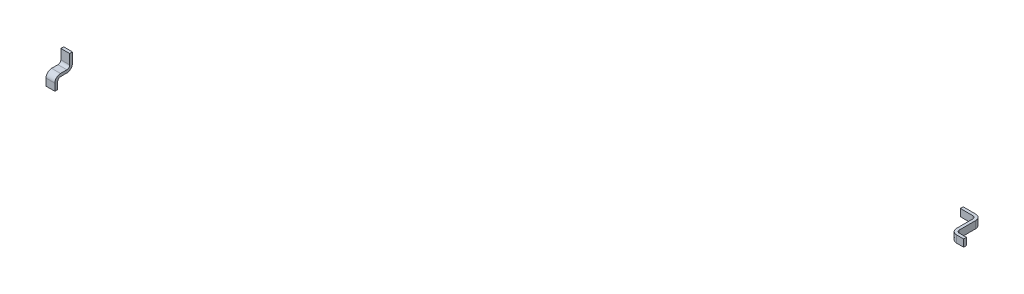
ISO-10303-21;
HEADER;
FILE_DESCRIPTION(('STEP AP214'),'2;1');
FILE_NAME('part.step','',(''),(''),'','','');
FILE_SCHEMA(('AUTOMOTIVE_DESIGN { 1 0 10303 214 1 1 1 1 }'));
ENDSEC;
DATA;
#1=APPLICATION_CONTEXT('core data for automotive mechanical design processes');
#2=APPLICATION_PROTOCOL_DEFINITION('international standard','automotive_design',2000,#1);
#3=PRODUCT_CONTEXT('',#1,'mechanical');
#4=PRODUCT('Part','Part','',(#3));
#5=PRODUCT_RELATED_PRODUCT_CATEGORY('part','',(#4));
#6=PRODUCT_DEFINITION_FORMATION('','',#4);
#7=PRODUCT_DEFINITION_CONTEXT('part definition',#1,'design');
#8=PRODUCT_DEFINITION('design','',#6,#7);
#9=PRODUCT_DEFINITION_SHAPE('','',#8);
#10=(LENGTH_UNIT() NAMED_UNIT(*) SI_UNIT(.MILLI.,.METRE.));
#11=(NAMED_UNIT(*) PLANE_ANGLE_UNIT() SI_UNIT($,.RADIAN.));
#12=(NAMED_UNIT(*) SI_UNIT($,.STERADIAN.) SOLID_ANGLE_UNIT());
#13=UNCERTAINTY_MEASURE_WITH_UNIT(LENGTH_MEASURE(1.E-05),#10,'distance_accuracy_value','');
#14=(GEOMETRIC_REPRESENTATION_CONTEXT(3) GLOBAL_UNCERTAINTY_ASSIGNED_CONTEXT((#13)) GLOBAL_UNIT_ASSIGNED_CONTEXT((#10,
#11,#12)) REPRESENTATION_CONTEXT('',''));
#15=CARTESIAN_POINT('',(0.,0.,0.));
#16=DIRECTION('',(0.,0.,1.));
#17=DIRECTION('',(1.,0.,0.));
#18=AXIS2_PLACEMENT_3D('',#15,#16,#17);
#19=CARTESIAN_POINT('',(-31.0295005463849,-0.229824856254154,2.05031594000001));
#20=DIRECTION('',(4.371138828674E-08,-1.,0.));
#21=DIRECTION('',(0.,0.,-1.));
#22=AXIS2_PLACEMENT_3D('',#19,#20,#21);
#23=PLANE('',#22);
#24=DIRECTION('',(1.,4.371138828674E-08,0.));
#25=VECTOR('',#24,1.);
#26=CARTESIAN_POINT('',(-31.0295005463849,-0.229824856254154,2.05031594000001));
#27=LINE('',#26,#25);
#28=CARTESIAN_POINT('',(-31.3445005463849,-0.229824870023251,2.05031594000001));
#29=VERTEX_POINT('',#28);
#30=CARTESIAN_POINT('',(-31.0295005463849,-0.229824856254154,2.05031594000001));
#31=VERTEX_POINT('',#30);
#32=EDGE_CURVE('P0_E193',#29,#31,#27,.T.);
#33=ORIENTED_EDGE('',*,*,#32,.F.);
#34=DIRECTION('',(0.,0.,-1.));
#35=VECTOR('',#34,1.);
#36=CARTESIAN_POINT('',(-31.3445005463849,-0.229824870023251,2.57531594000001));
#37=LINE('',#36,#35);
#38=CARTESIAN_POINT('',(-31.3445005463849,-0.229824870023251,2.15031594000001));
#39=VERTEX_POINT('',#38);
#40=EDGE_CURVE('P0_E11',#39,#29,#37,.T.);
#41=ORIENTED_EDGE('',*,*,#40,.F.);
#42=DIRECTION('',(-1.,-4.371138828674E-08,0.));
#43=VECTOR('',#42,1.);
#44=CARTESIAN_POINT('',(-31.3445005463849,-0.229824870023251,2.15031594000001));
#45=LINE('',#44,#43);
#46=CARTESIAN_POINT('',(-31.0295005463849,-0.229824856254154,2.15031594000001));
#47=VERTEX_POINT('',#46);
#48=EDGE_CURVE('P0_E122',#47,#39,#45,.T.);
#49=ORIENTED_EDGE('',*,*,#48,.F.);
#50=DIRECTION('',(0.,0.,1.));
#51=VECTOR('',#50,1.);
#52=CARTESIAN_POINT('',(-31.0295005463849,-0.229824856254154,2.67531594000001));
#53=LINE('',#52,#51);
#54=EDGE_CURVE('P0_E124',#31,#47,#53,.T.);
#55=ORIENTED_EDGE('',*,*,#54,.F.);
#56=EDGE_LOOP('',(#33,#41,#49,#55));
#57=FACE_BOUND('',#56,.T.);
#58=ADVANCED_FACE('P0_F17',(#57),#23,.F.);
#59=CARTESIAN_POINT('',(-31.3445005070446,-1.12982487002325,2.57531594000001));
#60=DIRECTION('',(1.,4.371138828674E-08,0.));
#61=DIRECTION('',(0.,0.,-1.));
#62=AXIS2_PLACEMENT_3D('',#59,#60,#61);
#63=PLANE('',#62);
#64=DIRECTION('',(-4.371138828674E-08,1.,0.));
#65=VECTOR('',#64,1.);
#66=CARTESIAN_POINT('',(-31.3445005070446,-1.12982487002325,2.67531594000001));
#67=LINE('',#66,#65);
#68=CARTESIAN_POINT('',(-31.3445005070446,-1.12982487002325,2.67531594000001));
#69=VERTEX_POINT('',#68);
#70=CARTESIAN_POINT('',(-31.3445005179725,-0.879824870023249,2.67531594000001));
#71=VERTEX_POINT('',#70);
#72=EDGE_CURVE('P0_E241',#69,#71,#67,.T.);
#73=ORIENTED_EDGE('',*,*,#72,.T.);
#74=CARTESIAN_POINT('',(-31.3445005179725,-0.879824870023249,2.47531594000001));
#75=DIRECTION('',(-1.,-4.371138828674E-08,0.));
#76=DIRECTION('',(0.,0.,-1.));
#77=AXIS2_PLACEMENT_3D('',#74,#75,#76);
#78=CIRCLE('',#77,0.2);
#79=CARTESIAN_POINT('',(-31.3445005267148,-0.679824870023243,2.47531594000001));
#80=VERTEX_POINT('',#79);
#81=EDGE_CURVE('P0_E174',#71,#80,#78,.T.);
#82=ORIENTED_EDGE('',*,*,#81,.T.);
#83=DIRECTION('',(0.,0.,-1.));
#84=VECTOR('',#83,1.);
#85=CARTESIAN_POINT('',(-31.3445005267148,-0.679824870023243,2.57531594000001));
#86=LINE('',#85,#84);
#87=CARTESIAN_POINT('',(-31.3445005267148,-0.679824870023243,2.25031594000001));
#88=VERTEX_POINT('',#87);
#89=EDGE_CURVE('P0_E169',#80,#88,#86,.T.);
#90=ORIENTED_EDGE('',*,*,#89,.T.);
#91=CARTESIAN_POINT('',(-31.3445005310859,-0.579824870023241,2.25031594000001));
#92=DIRECTION('',(1.,4.371138828674E-08,0.));
#93=DIRECTION('',(0.,0.,-1.));
#94=AXIS2_PLACEMENT_3D('',#91,#92,#93);
#95=CIRCLE('',#94,0.1);
#96=CARTESIAN_POINT('',(-31.3445005310859,-0.579824870023241,2.15031594000001));
#97=VERTEX_POINT('',#96);
#98=EDGE_CURVE('P0_E127',#88,#97,#95,.T.);
#99=ORIENTED_EDGE('',*,*,#98,.T.);
#100=DIRECTION('',(-4.371138828674E-08,1.,0.));
#101=VECTOR('',#100,1.);
#102=CARTESIAN_POINT('',(-31.3445005070446,-1.12982487002325,2.15031594000001));
#103=LINE('',#102,#101);
#104=EDGE_CURVE('P0_E28',#97,#39,#103,.T.);
#105=ORIENTED_EDGE('',*,*,#104,.T.);
#106=ORIENTED_EDGE('',*,*,#40,.T.);
#107=DIRECTION('',(-4.371138828674E-08,1.,0.));
#108=VECTOR('',#107,1.);
#109=CARTESIAN_POINT('',(-31.3445005310859,-0.579824870023241,2.05031594000001));
#110=LINE('',#109,#108);
#111=CARTESIAN_POINT('',(-31.3445005310859,-0.579824870023241,2.05031594000001));
#112=VERTEX_POINT('',#111);
#113=EDGE_CURVE('P0_E149',#112,#29,#110,.T.);
#114=ORIENTED_EDGE('',*,*,#113,.F.);
#115=CARTESIAN_POINT('',(-31.3445005310859,-0.579824870023241,2.25031594000001));
#116=DIRECTION('',(1.,4.371138828674E-08,0.));
#117=DIRECTION('',(0.,0.,-1.));
#118=AXIS2_PLACEMENT_3D('',#115,#116,#117);
#119=CIRCLE('',#118,0.2);
#120=CARTESIAN_POINT('',(-31.3445005223436,-0.779824870023246,2.25031594000001));
#121=VERTEX_POINT('',#120);
#122=EDGE_CURVE('P0_E159',#121,#112,#119,.T.);
#123=ORIENTED_EDGE('',*,*,#122,.F.);
#124=DIRECTION('',(0.,0.,-1.));
#125=VECTOR('',#124,1.);
#126=CARTESIAN_POINT('',(-31.3445005223436,-0.779824870023246,2.47531594000001));
#127=LINE('',#126,#125);
#128=CARTESIAN_POINT('',(-31.3445005223436,-0.779824870023246,2.47531594000001));
#129=VERTEX_POINT('',#128);
#130=EDGE_CURVE('P0_E164',#129,#121,#127,.T.);
#131=ORIENTED_EDGE('',*,*,#130,.F.);
#132=CARTESIAN_POINT('',(-31.3445005179725,-0.879824870023249,2.47531594000001));
#133=DIRECTION('',(-1.,-4.371138828674E-08,0.));
#134=DIRECTION('',(0.,0.,-1.));
#135=AXIS2_PLACEMENT_3D('',#132,#133,#134);
#136=CIRCLE('',#135,0.1);
#137=CARTESIAN_POINT('',(-31.3445005179725,-0.879824870023249,2.57531594000001));
#138=VERTEX_POINT('',#137);
#139=EDGE_CURVE('P0_E179',#138,#129,#136,.T.);
#140=ORIENTED_EDGE('',*,*,#139,.F.);
#141=DIRECTION('',(-4.371138828674E-08,1.,0.));
#142=VECTOR('',#141,1.);
#143=CARTESIAN_POINT('',(-31.3445005070446,-1.12982487002325,2.57531594000001));
#144=LINE('',#143,#142);
#145=CARTESIAN_POINT('',(-31.3445005070446,-1.12982487002325,2.57531594000001));
#146=VERTEX_POINT('',#145);
#147=EDGE_CURVE('P0_E223',#146,#138,#144,.T.);
#148=ORIENTED_EDGE('',*,*,#147,.F.);
#149=DIRECTION('',(0.,0.,-1.));
#150=VECTOR('',#149,1.);
#151=CARTESIAN_POINT('',(-31.3445005070446,-1.12982487002325,2.57531594000001));
#152=LINE('',#151,#150);
#153=EDGE_CURVE('P0_E230',#69,#146,#152,.T.);
#154=ORIENTED_EDGE('',*,*,#153,.F.);
#155=EDGE_LOOP('',(#73,#82,#90,#99,#105,#106,#114,#123,#131,#140,#148,#154));
#156=FACE_BOUND('',#155,.T.);
#157=ADVANCED_FACE('P0_F272',(#156),#63,.F.);
#158=CARTESIAN_POINT('',(-31.3445005310859,-0.579824870023241,2.15031594000001));
#159=DIRECTION('',(0.,0.,-1.));
#160=DIRECTION('',(-1.,-4.371138828674E-08,0.));
#161=AXIS2_PLACEMENT_3D('',#158,#159,#160);
#162=PLANE('',#161);
#163=ORIENTED_EDGE('',*,*,#48,.T.);
#164=ORIENTED_EDGE('',*,*,#104,.F.);
#165=DIRECTION('',(1.,4.371138828674E-08,0.));
#166=VECTOR('',#165,1.);
#167=CARTESIAN_POINT('',(-31.3445005310859,-0.579824870023241,2.15031594000001));
#168=LINE('',#167,#166);
#169=CARTESIAN_POINT('',(-31.029500531086,-0.579824856254158,2.15031594000001));
#170=VERTEX_POINT('',#169);
#171=EDGE_CURVE('P0_E118',#97,#170,#168,.T.);
#172=ORIENTED_EDGE('',*,*,#171,.T.);
#173=DIRECTION('',(-4.371138828674E-08,1.,0.));
#174=VECTOR('',#173,1.);
#175=CARTESIAN_POINT('',(-31.029500531086,-0.579824856254158,2.15031594000001));
#176=LINE('',#175,#174);
#177=EDGE_CURVE('P0_E129',#170,#47,#176,.T.);
#178=ORIENTED_EDGE('',*,*,#177,.T.);
#179=EDGE_LOOP('',(#163,#164,#172,#178));
#180=FACE_BOUND('',#179,.T.);
#181=ADVANCED_FACE('P0_F130',(#180),#162,.F.);
#182=CARTESIAN_POINT('',(-31.3445005310859,-0.579824870023241,2.25031594000001));
#183=DIRECTION('',(1.,4.371138828674E-08,0.));
#184=DIRECTION('',(0.,0.,-1.));
#185=AXIS2_PLACEMENT_3D('',#182,#183,#184);
#186=CYLINDRICAL_SURFACE('',#185,0.1);
#187=ORIENTED_EDGE('',*,*,#171,.F.);
#188=ORIENTED_EDGE('',*,*,#98,.F.);
#189=DIRECTION('',(-1.,-4.371138828674E-08,0.));
#190=VECTOR('',#189,1.);
#191=CARTESIAN_POINT('',(-31.3445005267148,-0.679824870023243,2.25031594000001));
#192=LINE('',#191,#190);
#193=CARTESIAN_POINT('',(-31.0295005267148,-0.67982485625416,2.25031594000001));
#194=VERTEX_POINT('',#193);
#195=EDGE_CURVE('P0_E173',#194,#88,#192,.T.);
#196=ORIENTED_EDGE('',*,*,#195,.F.);
#197=CARTESIAN_POINT('',(-31.029500531086,-0.579824856254158,2.25031594000001));
#198=DIRECTION('',(1.,4.371138828674E-08,0.));
#199=DIRECTION('',(0.,0.,1.));
#200=AXIS2_PLACEMENT_3D('',#197,#198,#199);
#201=CIRCLE('',#200,0.1);
#202=EDGE_CURVE('P0_E142',#194,#170,#201,.T.);
#203=ORIENTED_EDGE('',*,*,#202,.T.);
#204=EDGE_LOOP('',(#187,#188,#196,#203));
#205=FACE_BOUND('',#204,.T.);
#206=ADVANCED_FACE('P0_F274',(#205),#186,.F.);
#207=CARTESIAN_POINT('',(-31.3445005267148,-0.679824870023243,2.47531594000001));
#208=DIRECTION('',(4.371138828674E-08,-1.,0.));
#209=DIRECTION('',(-1.,-4.371138828674E-08,0.));
#210=AXIS2_PLACEMENT_3D('',#207,#208,#209);
#211=PLANE('',#210);
#212=ORIENTED_EDGE('',*,*,#195,.T.);
#213=ORIENTED_EDGE('',*,*,#89,.F.);
#214=DIRECTION('',(-1.,-4.371138828674E-08,0.));
#215=VECTOR('',#214,1.);
#216=CARTESIAN_POINT('',(-31.3445005267148,-0.679824870023243,2.47531594000001));
#217=LINE('',#216,#215);
#218=CARTESIAN_POINT('',(-31.0295005267148,-0.67982485625416,2.47531594000001));
#219=VERTEX_POINT('',#218);
#220=EDGE_CURVE('P0_E178',#219,#80,#217,.T.);
#221=ORIENTED_EDGE('',*,*,#220,.F.);
#222=DIRECTION('',(0.,0.,-1.));
#223=VECTOR('',#222,1.);
#224=CARTESIAN_POINT('',(-31.0295005267148,-0.67982485625416,2.47531594000001));
#225=LINE('',#224,#223);
#226=EDGE_CURVE('P0_E146',#219,#194,#225,.T.);
#227=ORIENTED_EDGE('',*,*,#226,.T.);
#228=EDGE_LOOP('',(#212,#213,#221,#227));
#229=FACE_BOUND('',#228,.T.);
#230=ADVANCED_FACE('P0_F278',(#229),#211,.F.);
#231=CARTESIAN_POINT('',(-31.3445005179725,-0.879824870023249,2.47531594000001));
#232=DIRECTION('',(-1.,-4.371138828674E-08,0.));
#233=DIRECTION('',(0.,0.,-1.));
#234=AXIS2_PLACEMENT_3D('',#231,#232,#233);
#235=CYLINDRICAL_SURFACE('',#234,0.2);
#236=CARTESIAN_POINT('',(-31.0295005179725,-0.879824856254152,2.47531594000001));
#237=DIRECTION('',(-1.,-4.371138828674E-08,0.));
#238=DIRECTION('',(0.,0.,1.));
#239=AXIS2_PLACEMENT_3D('',#236,#237,#238);
#240=CIRCLE('',#239,0.2);
#241=CARTESIAN_POINT('',(-31.0295005179725,-0.879824856254152,2.67531594000001));
#242=VERTEX_POINT('',#241);
#243=EDGE_CURVE('P0_E187',#242,#219,#240,.T.);
#244=ORIENTED_EDGE('',*,*,#243,.T.);
#245=ORIENTED_EDGE('',*,*,#220,.T.);
#246=ORIENTED_EDGE('',*,*,#81,.F.);
#247=DIRECTION('',(-1.,-4.371138828674E-08,0.));
#248=VECTOR('',#247,1.);
#249=CARTESIAN_POINT('',(-31.3445005179725,-0.879824870023249,2.67531594000001));
#250=LINE('',#249,#248);
#251=EDGE_CURVE('P0_E135',#242,#71,#250,.T.);
#252=ORIENTED_EDGE('',*,*,#251,.F.);
#253=EDGE_LOOP('',(#244,#245,#246,#252));
#254=FACE_BOUND('',#253,.T.);
#255=ADVANCED_FACE('P0_F280',(#254),#235,.T.);
#256=CARTESIAN_POINT('',(-31.3445005070446,-1.12982487002325,2.67531594000001));
#257=DIRECTION('',(0.,0.,-1.));
#258=DIRECTION('',(-1.,-4.371138828674E-08,0.));
#259=AXIS2_PLACEMENT_3D('',#256,#257,#258);
#260=PLANE('',#259);
#261=ORIENTED_EDGE('',*,*,#251,.T.);
#262=ORIENTED_EDGE('',*,*,#72,.F.);
#263=DIRECTION('',(-1.,-4.371138828674E-08,0.));
#264=VECTOR('',#263,1.);
#265=CARTESIAN_POINT('',(-31.3445005070446,-1.12982487002325,2.67531594000001));
#266=LINE('',#265,#264);
#267=CARTESIAN_POINT('',(-31.0295005070447,-1.12982485625415,2.67531594000001));
#268=VERTEX_POINT('',#267);
#269=EDGE_CURVE('P0_E217',#268,#69,#266,.T.);
#270=ORIENTED_EDGE('',*,*,#269,.F.);
#271=DIRECTION('',(-4.371138828674E-08,1.,0.));
#272=VECTOR('',#271,1.);
#273=CARTESIAN_POINT('',(-31.0295005070447,-1.12982485625415,2.67531594000001));
#274=LINE('',#273,#272);
#275=EDGE_CURVE('P0_E153',#268,#242,#274,.T.);
#276=ORIENTED_EDGE('',*,*,#275,.T.);
#277=EDGE_LOOP('',(#261,#262,#270,#276));
#278=FACE_BOUND('',#277,.T.);
#279=ADVANCED_FACE('P0_F286',(#278),#260,.F.);
#280=CARTESIAN_POINT('',(-31.0295005070447,-1.12982485625415,2.67531594000001));
#281=DIRECTION('',(-1.,-4.371138828674E-08,0.));
#282=DIRECTION('',(0.,0.,1.));
#283=AXIS2_PLACEMENT_3D('',#280,#281,#282);
#284=PLANE('',#283);
#285=DIRECTION('',(-4.371138828674E-08,1.,0.));
#286=VECTOR('',#285,1.);
#287=CARTESIAN_POINT('',(-31.0295005070447,-1.12982485625415,2.57531594000001));
#288=LINE('',#287,#286);
#289=CARTESIAN_POINT('',(-31.0295005070447,-1.12982485625415,2.57531594000001));
#290=VERTEX_POINT('',#289);
#291=CARTESIAN_POINT('',(-31.0295005179725,-0.879824856254152,2.57531594000001));
#292=VERTEX_POINT('',#291);
#293=EDGE_CURVE('P0_E220',#290,#292,#288,.T.);
#294=ORIENTED_EDGE('',*,*,#293,.T.);
#295=CARTESIAN_POINT('',(-31.0295005179725,-0.879824856254152,2.47531594000001));
#296=DIRECTION('',(-1.,-4.371138828674E-08,0.));
#297=DIRECTION('',(0.,0.,1.));
#298=AXIS2_PLACEMENT_3D('',#295,#296,#297);
#299=CIRCLE('',#298,0.1);
#300=CARTESIAN_POINT('',(-31.0295005223437,-0.779824856254163,2.47531594000001));
#301=VERTEX_POINT('',#300);
#302=EDGE_CURVE('P0_E21',#292,#301,#299,.T.);
#303=ORIENTED_EDGE('',*,*,#302,.T.);
#304=DIRECTION('',(0.,0.,-1.));
#305=VECTOR('',#304,1.);
#306=CARTESIAN_POINT('',(-31.0295005223437,-0.779824856254163,2.67531594000001));
#307=LINE('',#306,#305);
#308=CARTESIAN_POINT('',(-31.0295005223437,-0.779824856254163,2.25031594000001));
#309=VERTEX_POINT('',#308);
#310=EDGE_CURVE('P0_E168',#301,#309,#307,.T.);
#311=ORIENTED_EDGE('',*,*,#310,.T.);
#312=CARTESIAN_POINT('',(-31.029500531086,-0.579824856254158,2.25031594000001));
#313=DIRECTION('',(1.,4.371138828674E-08,0.));
#314=DIRECTION('',(0.,0.,1.));
#315=AXIS2_PLACEMENT_3D('',#312,#313,#314);
#316=CIRCLE('',#315,0.2);
#317=CARTESIAN_POINT('',(-31.029500531086,-0.579824856254158,2.05031594000001));
#318=VERTEX_POINT('',#317);
#319=EDGE_CURVE('P0_E194',#309,#318,#316,.T.);
#320=ORIENTED_EDGE('',*,*,#319,.T.);
#321=DIRECTION('',(-4.371138828674E-08,1.,0.));
#322=VECTOR('',#321,1.);
#323=CARTESIAN_POINT('',(-31.0295005070447,-1.12982485625415,2.05031594000001));
#324=LINE('',#323,#322);
#325=EDGE_CURVE('P0_E139',#318,#31,#324,.T.);
#326=ORIENTED_EDGE('',*,*,#325,.T.);
#327=ORIENTED_EDGE('',*,*,#54,.T.);
#328=ORIENTED_EDGE('',*,*,#177,.F.);
#329=ORIENTED_EDGE('',*,*,#202,.F.);
#330=ORIENTED_EDGE('',*,*,#226,.F.);
#331=ORIENTED_EDGE('',*,*,#243,.F.);
#332=ORIENTED_EDGE('',*,*,#275,.F.);
#333=DIRECTION('',(0.,0.,1.));
#334=VECTOR('',#333,1.);
#335=CARTESIAN_POINT('',(-31.0295005070447,-1.12982485625415,2.67531594000001));
#336=LINE('',#335,#334);
#337=EDGE_CURVE('P0_E213',#290,#268,#336,.T.);
#338=ORIENTED_EDGE('',*,*,#337,.F.);
#339=EDGE_LOOP('',(#294,#303,#311,#320,#326,#327,#328,#329,#330,#331,#332,#338));
#340=FACE_BOUND('',#339,.T.);
#341=ADVANCED_FACE('P0_F19',(#340),#284,.F.);
#342=CARTESIAN_POINT('',(-31.029500531086,-0.579824856254158,2.05031594000001));
#343=DIRECTION('',(0.,0.,1.));
#344=DIRECTION('',(1.,4.371138828674E-08,0.));
#345=AXIS2_PLACEMENT_3D('',#342,#343,#344);
#346=PLANE('',#345);
#347=ORIENTED_EDGE('',*,*,#32,.T.);
#348=ORIENTED_EDGE('',*,*,#325,.F.);
#349=DIRECTION('',(1.,4.371138828674E-08,0.));
#350=VECTOR('',#349,1.);
#351=CARTESIAN_POINT('',(-31.029500531086,-0.579824856254158,2.05031594000001));
#352=LINE('',#351,#350);
#353=EDGE_CURVE('P0_E163',#112,#318,#352,.T.);
#354=ORIENTED_EDGE('',*,*,#353,.F.);
#355=ORIENTED_EDGE('',*,*,#113,.T.);
#356=EDGE_LOOP('',(#347,#348,#354,#355));
#357=FACE_BOUND('',#356,.T.);
#358=ADVANCED_FACE('P0_F269',(#357),#346,.F.);
#359=CARTESIAN_POINT('',(-31.029500531086,-0.579824856254158,2.25031594000001));
#360=DIRECTION('',(1.,4.371138828674E-08,0.));
#361=DIRECTION('',(0.,0.,-1.));
#362=AXIS2_PLACEMENT_3D('',#359,#360,#361);
#363=CYLINDRICAL_SURFACE('',#362,0.2);
#364=ORIENTED_EDGE('',*,*,#122,.T.);
#365=ORIENTED_EDGE('',*,*,#353,.T.);
#366=ORIENTED_EDGE('',*,*,#319,.F.);
#367=DIRECTION('',(1.,4.371138828674E-08,0.));
#368=VECTOR('',#367,1.);
#369=CARTESIAN_POINT('',(-31.0295005223437,-0.779824856254163,2.25031594000001));
#370=LINE('',#369,#368);
#371=EDGE_CURVE('P0_E182',#121,#309,#370,.T.);
#372=ORIENTED_EDGE('',*,*,#371,.F.);
#373=EDGE_LOOP('',(#364,#365,#366,#372));
#374=FACE_BOUND('',#373,.T.);
#375=ADVANCED_FACE('P0_F329',(#374),#363,.T.);
#376=CARTESIAN_POINT('',(-31.0295005223437,-0.779824856254163,2.47531594000001));
#377=DIRECTION('',(-4.371138828674E-08,1.,0.));
#378=DIRECTION('',(1.,4.371138828674E-08,0.));
#379=AXIS2_PLACEMENT_3D('',#376,#377,#378);
#380=PLANE('',#379);
#381=ORIENTED_EDGE('',*,*,#371,.T.);
#382=ORIENTED_EDGE('',*,*,#310,.F.);
#383=DIRECTION('',(-1.,-4.371138828674E-08,0.));
#384=VECTOR('',#383,1.);
#385=CARTESIAN_POINT('',(-31.0295005223437,-0.779824856254163,2.47531594000001));
#386=LINE('',#385,#384);
#387=EDGE_CURVE('P0_E208',#301,#129,#386,.T.);
#388=ORIENTED_EDGE('',*,*,#387,.T.);
#389=ORIENTED_EDGE('',*,*,#130,.T.);
#390=EDGE_LOOP('',(#381,#382,#388,#389));
#391=FACE_BOUND('',#390,.T.);
#392=ADVANCED_FACE('P0_F327',(#391),#380,.F.);
#393=CARTESIAN_POINT('',(-31.0295005179725,-0.879824856254152,2.47531594000001));
#394=DIRECTION('',(-1.,-4.371138828674E-08,0.));
#395=DIRECTION('',(0.,0.,-1.));
#396=AXIS2_PLACEMENT_3D('',#393,#394,#395);
#397=CYLINDRICAL_SURFACE('',#396,0.1);
#398=ORIENTED_EDGE('',*,*,#387,.F.);
#399=ORIENTED_EDGE('',*,*,#302,.F.);
#400=DIRECTION('',(1.,4.371138828674E-08,0.));
#401=VECTOR('',#400,1.);
#402=CARTESIAN_POINT('',(-31.0295005179725,-0.879824856254152,2.57531594000001));
#403=LINE('',#402,#401);
#404=EDGE_CURVE('P0_E224',#138,#292,#403,.T.);
#405=ORIENTED_EDGE('',*,*,#404,.F.);
#406=ORIENTED_EDGE('',*,*,#139,.T.);
#407=EDGE_LOOP('',(#398,#399,#405,#406));
#408=FACE_BOUND('',#407,.T.);
#409=ADVANCED_FACE('P0_F321',(#408),#397,.F.);
#410=CARTESIAN_POINT('',(-31.0295005070447,-1.12982485625415,2.57531594000001));
#411=DIRECTION('',(0.,0.,1.));
#412=DIRECTION('',(1.,4.371138828674E-08,0.));
#413=AXIS2_PLACEMENT_3D('',#410,#411,#412);
#414=PLANE('',#413);
#415=ORIENTED_EDGE('',*,*,#404,.T.);
#416=ORIENTED_EDGE('',*,*,#293,.F.);
#417=DIRECTION('',(1.,4.371138828674E-08,0.));
#418=VECTOR('',#417,1.);
#419=CARTESIAN_POINT('',(-31.0295005070447,-1.12982485625415,2.57531594000001));
#420=LINE('',#419,#418);
#421=EDGE_CURVE('P0_E258',#146,#290,#420,.T.);
#422=ORIENTED_EDGE('',*,*,#421,.F.);
#423=ORIENTED_EDGE('',*,*,#147,.T.);
#424=EDGE_LOOP('',(#415,#416,#422,#423));
#425=FACE_BOUND('',#424,.T.);
#426=ADVANCED_FACE('P0_F311',(#425),#414,.F.);
#427=CARTESIAN_POINT('',(-31.0295005070447,-1.12982485625415,2.57531594000001));
#428=DIRECTION('',(4.371138828674E-08,-1.,0.));
#429=DIRECTION('',(0.,0.,-1.));
#430=AXIS2_PLACEMENT_3D('',#427,#428,#429);
#431=PLANE('',#430);
#432=ORIENTED_EDGE('',*,*,#337,.T.);
#433=ORIENTED_EDGE('',*,*,#269,.T.);
#434=ORIENTED_EDGE('',*,*,#153,.T.);
#435=ORIENTED_EDGE('',*,*,#421,.T.);
#436=EDGE_LOOP('',(#432,#433,#434,#435));
#437=FACE_BOUND('',#436,.T.);
#438=ADVANCED_FACE('P0_F293',(#437),#431,.T.);
#439=CLOSED_SHELL('',(#58,#157,#181,#206,#230,#255,#279,#341,#358,#375,#392,#409,#426,#438));
#440=MANIFOLD_SOLID_BREP('P0_B1',#439);
#441=CARTESIAN_POINT('',(0.599705188148059,10.8209646408175,2.05031594000001));
#442=DIRECTION('',(1.,0.,0.));
#443=DIRECTION('',(0.,0.,-1.));
#444=AXIS2_PLACEMENT_3D('',#441,#442,#443);
#445=PLANE('',#444);
#446=DIRECTION('',(0.,1.,0.));
#447=VECTOR('',#446,1.);
#448=CARTESIAN_POINT('',(0.599705188148059,10.8209646408175,2.05031594000001));
#449=LINE('',#448,#447);
#450=CARTESIAN_POINT('',(0.599705188148059,10.5659646408175,2.05031594000001));
#451=VERTEX_POINT('',#450);
#452=CARTESIAN_POINT('',(0.599705188148059,10.8209646408175,2.05031594000001));
#453=VERTEX_POINT('',#452);
#454=EDGE_CURVE('P1_E193',#451,#453,#449,.T.);
#455=ORIENTED_EDGE('',*,*,#454,.F.);
#456=DIRECTION('',(0.,0.,-1.));
#457=VECTOR('',#456,1.);
#458=CARTESIAN_POINT('',(0.599705188148059,10.5659646408175,2.93031594000001));
#459=LINE('',#458,#457);
#460=CARTESIAN_POINT('',(0.599705188148059,10.5659646408175,2.15031594000001));
#461=VERTEX_POINT('',#460);
#462=EDGE_CURVE('P1_E11',#461,#451,#459,.T.);
#463=ORIENTED_EDGE('',*,*,#462,.F.);
#464=DIRECTION('',(0.,-1.,0.));
#465=VECTOR('',#464,1.);
#466=CARTESIAN_POINT('',(0.599705188148059,10.5659646408175,2.15031594000001));
#467=LINE('',#466,#465);
#468=CARTESIAN_POINT('',(0.599705188148059,10.8209646408175,2.15031594000001));
#469=VERTEX_POINT('',#468);
#470=EDGE_CURVE('P1_E122',#469,#461,#467,.T.);
#471=ORIENTED_EDGE('',*,*,#470,.F.);
#472=DIRECTION('',(0.,0.,1.));
#473=VECTOR('',#472,1.);
#474=CARTESIAN_POINT('',(0.599705188148059,10.8209646408175,3.03031594000001));
#475=LINE('',#474,#473);
#476=EDGE_CURVE('P1_E124',#453,#469,#475,.T.);
#477=ORIENTED_EDGE('',*,*,#476,.F.);
#478=EDGE_LOOP('',(#455,#463,#471,#477));
#479=FACE_BOUND('',#478,.T.);
#480=ADVANCED_FACE('P1_F17',(#479),#445,.F.);
#481=CARTESIAN_POINT('',(1.59720518814807,10.5659646408175,2.93031594000001));
#482=DIRECTION('',(0.,1.,0.));
#483=DIRECTION('',(0.,0.,-1.));
#484=AXIS2_PLACEMENT_3D('',#481,#482,#483);
#485=PLANE('',#484);
#486=DIRECTION('',(-1.,0.,0.));
#487=VECTOR('',#486,1.);
#488=CARTESIAN_POINT('',(1.59720518814807,10.5659646408175,3.03031594000001));
#489=LINE('',#488,#487);
#490=CARTESIAN_POINT('',(1.59720518814807,10.5659646408175,3.03031594000001));
#491=VERTEX_POINT('',#490);
#492=CARTESIAN_POINT('',(1.34470518814808,10.5659646408175,3.03031594000001));
#493=VERTEX_POINT('',#492);
#494=EDGE_CURVE('P1_E241',#491,#493,#489,.T.);
#495=ORIENTED_EDGE('',*,*,#494,.T.);
#496=CARTESIAN_POINT('',(1.34470518814808,10.5659646408175,2.83031594000001));
#497=DIRECTION('',(0.,-1.,0.));
#498=DIRECTION('',(0.,0.,-1.));
#499=AXIS2_PLACEMENT_3D('',#496,#497,#498);
#500=CIRCLE('',#499,0.2);
#501=CARTESIAN_POINT('',(1.14470518814808,10.5659646408175,2.83031594000001));
#502=VERTEX_POINT('',#501);
#503=EDGE_CURVE('P1_E174',#493,#502,#500,.T.);
#504=ORIENTED_EDGE('',*,*,#503,.T.);
#505=DIRECTION('',(0.,0.,-1.));
#506=VECTOR('',#505,1.);
#507=CARTESIAN_POINT('',(1.14470518814808,10.5659646408175,2.93031594000001));
#508=LINE('',#507,#506);
#509=CARTESIAN_POINT('',(1.14470518814808,10.5659646408175,2.25031594000001));
#510=VERTEX_POINT('',#509);
#511=EDGE_CURVE('P1_E169',#502,#510,#508,.T.);
#512=ORIENTED_EDGE('',*,*,#511,.T.);
#513=CARTESIAN_POINT('',(1.04470518814806,10.5659646408175,2.25031594000001));
#514=DIRECTION('',(0.,1.,0.));
#515=DIRECTION('',(0.,0.,-1.));
#516=AXIS2_PLACEMENT_3D('',#513,#514,#515);
#517=CIRCLE('',#516,0.1);
#518=CARTESIAN_POINT('',(1.04470518814806,10.5659646408175,2.15031594000001));
#519=VERTEX_POINT('',#518);
#520=EDGE_CURVE('P1_E127',#510,#519,#517,.T.);
#521=ORIENTED_EDGE('',*,*,#520,.T.);
#522=DIRECTION('',(-1.,0.,0.));
#523=VECTOR('',#522,1.);
#524=CARTESIAN_POINT('',(1.59720518814807,10.5659646408175,2.15031594000001));
#525=LINE('',#524,#523);
#526=EDGE_CURVE('P1_E28',#519,#461,#525,.T.);
#527=ORIENTED_EDGE('',*,*,#526,.T.);
#528=ORIENTED_EDGE('',*,*,#462,.T.);
#529=DIRECTION('',(-1.,0.,0.));
#530=VECTOR('',#529,1.);
#531=CARTESIAN_POINT('',(1.04470518814806,10.5659646408175,2.05031594000001));
#532=LINE('',#531,#530);
#533=CARTESIAN_POINT('',(1.04470518814806,10.5659646408175,2.05031594000001));
#534=VERTEX_POINT('',#533);
#535=EDGE_CURVE('P1_E149',#534,#451,#532,.T.);
#536=ORIENTED_EDGE('',*,*,#535,.F.);
#537=CARTESIAN_POINT('',(1.04470518814806,10.5659646408175,2.25031594000001));
#538=DIRECTION('',(0.,1.,0.));
#539=DIRECTION('',(0.,0.,-1.));
#540=AXIS2_PLACEMENT_3D('',#537,#538,#539);
#541=CIRCLE('',#540,0.2);
#542=CARTESIAN_POINT('',(1.24470518814806,10.5659646408175,2.25031594000001));
#543=VERTEX_POINT('',#542);
#544=EDGE_CURVE('P1_E159',#543,#534,#541,.T.);
#545=ORIENTED_EDGE('',*,*,#544,.F.);
#546=DIRECTION('',(0.,0.,-1.));
#547=VECTOR('',#546,1.);
#548=CARTESIAN_POINT('',(1.24470518814806,10.5659646408175,2.83031594000001));
#549=LINE('',#548,#547);
#550=CARTESIAN_POINT('',(1.24470518814806,10.5659646408175,2.83031594000001));
#551=VERTEX_POINT('',#550);
#552=EDGE_CURVE('P1_E164',#551,#543,#549,.T.);
#553=ORIENTED_EDGE('',*,*,#552,.F.);
#554=CARTESIAN_POINT('',(1.34470518814808,10.5659646408175,2.83031594000001));
#555=DIRECTION('',(0.,-1.,0.));
#556=DIRECTION('',(0.,0.,-1.));
#557=AXIS2_PLACEMENT_3D('',#554,#555,#556);
#558=CIRCLE('',#557,0.1);
#559=CARTESIAN_POINT('',(1.34470518814808,10.5659646408175,2.93031594000001));
#560=VERTEX_POINT('',#559);
#561=EDGE_CURVE('P1_E179',#560,#551,#558,.T.);
#562=ORIENTED_EDGE('',*,*,#561,.F.);
#563=DIRECTION('',(-1.,0.,0.));
#564=VECTOR('',#563,1.);
#565=CARTESIAN_POINT('',(1.59720518814807,10.5659646408175,2.93031594000001));
#566=LINE('',#565,#564);
#567=CARTESIAN_POINT('',(1.59720518814807,10.5659646408175,2.93031594000001));
#568=VERTEX_POINT('',#567);
#569=EDGE_CURVE('P1_E223',#568,#560,#566,.T.);
#570=ORIENTED_EDGE('',*,*,#569,.F.);
#571=DIRECTION('',(0.,0.,-1.));
#572=VECTOR('',#571,1.);
#573=CARTESIAN_POINT('',(1.59720518814807,10.5659646408175,2.93031594000001));
#574=LINE('',#573,#572);
#575=EDGE_CURVE('P1_E230',#491,#568,#574,.T.);
#576=ORIENTED_EDGE('',*,*,#575,.F.);
#577=EDGE_LOOP('',(#495,#504,#512,#521,#527,#528,#536,#545,#553,#562,#570,#576));
#578=FACE_BOUND('',#577,.T.);
#579=ADVANCED_FACE('P1_F272',(#578),#485,.F.);
#580=CARTESIAN_POINT('',(1.04470518814806,10.5659646408175,2.15031594000001));
#581=DIRECTION('',(0.,0.,-1.));
#582=DIRECTION('',(0.,-1.,0.));
#583=AXIS2_PLACEMENT_3D('',#580,#581,#582);
#584=PLANE('',#583);
#585=ORIENTED_EDGE('',*,*,#470,.T.);
#586=ORIENTED_EDGE('',*,*,#526,.F.);
#587=DIRECTION('',(0.,1.,0.));
#588=VECTOR('',#587,1.);
#589=CARTESIAN_POINT('',(1.04470518814806,10.5659646408175,2.15031594000001));
#590=LINE('',#589,#588);
#591=CARTESIAN_POINT('',(1.04470518814806,10.8209646408175,2.15031594000001));
#592=VERTEX_POINT('',#591);
#593=EDGE_CURVE('P1_E118',#519,#592,#590,.T.);
#594=ORIENTED_EDGE('',*,*,#593,.T.);
#595=DIRECTION('',(-1.,0.,0.));
#596=VECTOR('',#595,1.);
#597=CARTESIAN_POINT('',(1.04470518814806,10.8209646408175,2.15031594000001));
#598=LINE('',#597,#596);
#599=EDGE_CURVE('P1_E129',#592,#469,#598,.T.);
#600=ORIENTED_EDGE('',*,*,#599,.T.);
#601=EDGE_LOOP('',(#585,#586,#594,#600));
#602=FACE_BOUND('',#601,.T.);
#603=ADVANCED_FACE('P1_F130',(#602),#584,.F.);
#604=CARTESIAN_POINT('',(1.04470518814806,10.5659646408175,2.25031594000001));
#605=DIRECTION('',(0.,1.,0.));
#606=DIRECTION('',(0.,0.,-1.));
#607=AXIS2_PLACEMENT_3D('',#604,#605,#606);
#608=CYLINDRICAL_SURFACE('',#607,0.1);
#609=ORIENTED_EDGE('',*,*,#593,.F.);
#610=ORIENTED_EDGE('',*,*,#520,.F.);
#611=DIRECTION('',(0.,-1.,0.));
#612=VECTOR('',#611,1.);
#613=CARTESIAN_POINT('',(1.14470518814808,10.5659646408175,2.25031594000001));
#614=LINE('',#613,#612);
#615=CARTESIAN_POINT('',(1.14470518814808,10.8209646408175,2.25031594000001));
#616=VERTEX_POINT('',#615);
#617=EDGE_CURVE('P1_E173',#616,#510,#614,.T.);
#618=ORIENTED_EDGE('',*,*,#617,.F.);
#619=CARTESIAN_POINT('',(1.04470518814806,10.8209646408175,2.25031594000001));
#620=DIRECTION('',(0.,1.,0.));
#621=DIRECTION('',(0.,0.,1.));
#622=AXIS2_PLACEMENT_3D('',#619,#620,#621);
#623=CIRCLE('',#622,0.1);
#624=EDGE_CURVE('P1_E142',#616,#592,#623,.T.);
#625=ORIENTED_EDGE('',*,*,#624,.T.);
#626=EDGE_LOOP('',(#609,#610,#618,#625));
#627=FACE_BOUND('',#626,.T.);
#628=ADVANCED_FACE('P1_F274',(#627),#608,.F.);
#629=CARTESIAN_POINT('',(1.14470518814808,10.5659646408175,2.83031594000001));
#630=DIRECTION('',(1.,0.,0.));
#631=DIRECTION('',(0.,-1.,0.));
#632=AXIS2_PLACEMENT_3D('',#629,#630,#631);
#633=PLANE('',#632);
#634=ORIENTED_EDGE('',*,*,#617,.T.);
#635=ORIENTED_EDGE('',*,*,#511,.F.);
#636=DIRECTION('',(0.,-1.,0.));
#637=VECTOR('',#636,1.);
#638=CARTESIAN_POINT('',(1.14470518814808,10.5659646408175,2.83031594000001));
#639=LINE('',#638,#637);
#640=CARTESIAN_POINT('',(1.14470518814808,10.8209646408175,2.83031594000001));
#641=VERTEX_POINT('',#640);
#642=EDGE_CURVE('P1_E178',#641,#502,#639,.T.);
#643=ORIENTED_EDGE('',*,*,#642,.F.);
#644=DIRECTION('',(0.,0.,-1.));
#645=VECTOR('',#644,1.);
#646=CARTESIAN_POINT('',(1.14470518814808,10.8209646408175,2.83031594000001));
#647=LINE('',#646,#645);
#648=EDGE_CURVE('P1_E146',#641,#616,#647,.T.);
#649=ORIENTED_EDGE('',*,*,#648,.T.);
#650=EDGE_LOOP('',(#634,#635,#643,#649));
#651=FACE_BOUND('',#650,.T.);
#652=ADVANCED_FACE('P1_F278',(#651),#633,.F.);
#653=CARTESIAN_POINT('',(1.34470518814808,10.5659646408175,2.83031594000001));
#654=DIRECTION('',(0.,-1.,0.));
#655=DIRECTION('',(0.,0.,-1.));
#656=AXIS2_PLACEMENT_3D('',#653,#654,#655);
#657=CYLINDRICAL_SURFACE('',#656,0.2);
#658=CARTESIAN_POINT('',(1.34470518814808,10.8209646408175,2.83031594000001));
#659=DIRECTION('',(0.,-1.,0.));
#660=DIRECTION('',(0.,0.,1.));
#661=AXIS2_PLACEMENT_3D('',#658,#659,#660);
#662=CIRCLE('',#661,0.2);
#663=CARTESIAN_POINT('',(1.34470518814808,10.8209646408175,3.03031594000001));
#664=VERTEX_POINT('',#663);
#665=EDGE_CURVE('P1_E187',#664,#641,#662,.T.);
#666=ORIENTED_EDGE('',*,*,#665,.T.);
#667=ORIENTED_EDGE('',*,*,#642,.T.);
#668=ORIENTED_EDGE('',*,*,#503,.F.);
#669=DIRECTION('',(0.,-1.,0.));
#670=VECTOR('',#669,1.);
#671=CARTESIAN_POINT('',(1.34470518814808,10.5659646408175,3.03031594000001));
#672=LINE('',#671,#670);
#673=EDGE_CURVE('P1_E135',#664,#493,#672,.T.);
#674=ORIENTED_EDGE('',*,*,#673,.F.);
#675=EDGE_LOOP('',(#666,#667,#668,#674));
#676=FACE_BOUND('',#675,.T.);
#677=ADVANCED_FACE('P1_F280',(#676),#657,.T.);
#678=CARTESIAN_POINT('',(1.59720518814807,10.5659646408175,3.03031594000001));
#679=DIRECTION('',(0.,0.,-1.));
#680=DIRECTION('',(0.,-1.,0.));
#681=AXIS2_PLACEMENT_3D('',#678,#679,#680);
#682=PLANE('',#681);
#683=ORIENTED_EDGE('',*,*,#673,.T.);
#684=ORIENTED_EDGE('',*,*,#494,.F.);
#685=DIRECTION('',(0.,-1.,0.));
#686=VECTOR('',#685,1.);
#687=CARTESIAN_POINT('',(1.59720518814807,10.5659646408175,3.03031594000001));
#688=LINE('',#687,#686);
#689=CARTESIAN_POINT('',(1.59720518814807,10.8209646408175,3.03031594000001));
#690=VERTEX_POINT('',#689);
#691=EDGE_CURVE('P1_E217',#690,#491,#688,.T.);
#692=ORIENTED_EDGE('',*,*,#691,.F.);
#693=DIRECTION('',(-1.,0.,0.));
#694=VECTOR('',#693,1.);
#695=CARTESIAN_POINT('',(1.59720518814807,10.8209646408175,3.03031594000001));
#696=LINE('',#695,#694);
#697=EDGE_CURVE('P1_E153',#690,#664,#696,.T.);
#698=ORIENTED_EDGE('',*,*,#697,.T.);
#699=EDGE_LOOP('',(#683,#684,#692,#698));
#700=FACE_BOUND('',#699,.T.);
#701=ADVANCED_FACE('P1_F286',(#700),#682,.F.);
#702=CARTESIAN_POINT('',(1.59720518814807,10.8209646408175,3.03031594000001));
#703=DIRECTION('',(0.,-1.,0.));
#704=DIRECTION('',(0.,0.,1.));
#705=AXIS2_PLACEMENT_3D('',#702,#703,#704);
#706=PLANE('',#705);
#707=DIRECTION('',(-1.,0.,0.));
#708=VECTOR('',#707,1.);
#709=CARTESIAN_POINT('',(1.59720518814807,10.8209646408175,2.93031594000001));
#710=LINE('',#709,#708);
#711=CARTESIAN_POINT('',(1.59720518814807,10.8209646408175,2.93031594000001));
#712=VERTEX_POINT('',#711);
#713=CARTESIAN_POINT('',(1.34470518814808,10.8209646408175,2.93031594000001));
#714=VERTEX_POINT('',#713);
#715=EDGE_CURVE('P1_E220',#712,#714,#710,.T.);
#716=ORIENTED_EDGE('',*,*,#715,.T.);
#717=CARTESIAN_POINT('',(1.34470518814808,10.8209646408175,2.83031594000001));
#718=DIRECTION('',(0.,-1.,0.));
#719=DIRECTION('',(0.,0.,1.));
#720=AXIS2_PLACEMENT_3D('',#717,#718,#719);
#721=CIRCLE('',#720,0.1);
#722=CARTESIAN_POINT('',(1.24470518814806,10.8209646408175,2.83031594000001));
#723=VERTEX_POINT('',#722);
#724=EDGE_CURVE('P1_E21',#714,#723,#721,.T.);
#725=ORIENTED_EDGE('',*,*,#724,.T.);
#726=DIRECTION('',(0.,0.,-1.));
#727=VECTOR('',#726,1.);
#728=CARTESIAN_POINT('',(1.24470518814806,10.8209646408175,3.03031594000001));
#729=LINE('',#728,#727);
#730=CARTESIAN_POINT('',(1.24470518814806,10.8209646408175,2.25031594000001));
#731=VERTEX_POINT('',#730);
#732=EDGE_CURVE('P1_E168',#723,#731,#729,.T.);
#733=ORIENTED_EDGE('',*,*,#732,.T.);
#734=CARTESIAN_POINT('',(1.04470518814806,10.8209646408175,2.25031594000001));
#735=DIRECTION('',(0.,1.,0.));
#736=DIRECTION('',(0.,0.,1.));
#737=AXIS2_PLACEMENT_3D('',#734,#735,#736);
#738=CIRCLE('',#737,0.2);
#739=CARTESIAN_POINT('',(1.04470518814806,10.8209646408175,2.05031594000001));
#740=VERTEX_POINT('',#739);
#741=EDGE_CURVE('P1_E194',#731,#740,#738,.T.);
#742=ORIENTED_EDGE('',*,*,#741,.T.);
#743=DIRECTION('',(-1.,0.,0.));
#744=VECTOR('',#743,1.);
#745=CARTESIAN_POINT('',(1.59720518814807,10.8209646408175,2.05031594000001));
#746=LINE('',#745,#744);
#747=EDGE_CURVE('P1_E139',#740,#453,#746,.T.);
#748=ORIENTED_EDGE('',*,*,#747,.T.);
#749=ORIENTED_EDGE('',*,*,#476,.T.);
#750=ORIENTED_EDGE('',*,*,#599,.F.);
#751=ORIENTED_EDGE('',*,*,#624,.F.);
#752=ORIENTED_EDGE('',*,*,#648,.F.);
#753=ORIENTED_EDGE('',*,*,#665,.F.);
#754=ORIENTED_EDGE('',*,*,#697,.F.);
#755=DIRECTION('',(0.,0.,1.));
#756=VECTOR('',#755,1.);
#757=CARTESIAN_POINT('',(1.59720518814807,10.8209646408175,3.03031594000001));
#758=LINE('',#757,#756);
#759=EDGE_CURVE('P1_E213',#712,#690,#758,.T.);
#760=ORIENTED_EDGE('',*,*,#759,.F.);
#761=EDGE_LOOP('',(#716,#725,#733,#742,#748,#749,#750,#751,#752,#753,#754,#760));
#762=FACE_BOUND('',#761,.T.);
#763=ADVANCED_FACE('P1_F19',(#762),#706,.F.);
#764=CARTESIAN_POINT('',(1.04470518814806,10.8209646408175,2.05031594000001));
#765=DIRECTION('',(0.,0.,1.));
#766=DIRECTION('',(0.,1.,0.));
#767=AXIS2_PLACEMENT_3D('',#764,#765,#766);
#768=PLANE('',#767);
#769=ORIENTED_EDGE('',*,*,#454,.T.);
#770=ORIENTED_EDGE('',*,*,#747,.F.);
#771=DIRECTION('',(0.,1.,0.));
#772=VECTOR('',#771,1.);
#773=CARTESIAN_POINT('',(1.04470518814806,10.8209646408175,2.05031594000001));
#774=LINE('',#773,#772);
#775=EDGE_CURVE('P1_E163',#534,#740,#774,.T.);
#776=ORIENTED_EDGE('',*,*,#775,.F.);
#777=ORIENTED_EDGE('',*,*,#535,.T.);
#778=EDGE_LOOP('',(#769,#770,#776,#777));
#779=FACE_BOUND('',#778,.T.);
#780=ADVANCED_FACE('P1_F269',(#779),#768,.F.);
#781=CARTESIAN_POINT('',(1.04470518814806,10.8209646408175,2.25031594000001));
#782=DIRECTION('',(0.,1.,0.));
#783=DIRECTION('',(0.,0.,-1.));
#784=AXIS2_PLACEMENT_3D('',#781,#782,#783);
#785=CYLINDRICAL_SURFACE('',#784,0.2);
#786=ORIENTED_EDGE('',*,*,#544,.T.);
#787=ORIENTED_EDGE('',*,*,#775,.T.);
#788=ORIENTED_EDGE('',*,*,#741,.F.);
#789=DIRECTION('',(0.,1.,0.));
#790=VECTOR('',#789,1.);
#791=CARTESIAN_POINT('',(1.24470518814806,10.8209646408175,2.25031594000001));
#792=LINE('',#791,#790);
#793=EDGE_CURVE('P1_E182',#543,#731,#792,.T.);
#794=ORIENTED_EDGE('',*,*,#793,.F.);
#795=EDGE_LOOP('',(#786,#787,#788,#794));
#796=FACE_BOUND('',#795,.T.);
#797=ADVANCED_FACE('P1_F329',(#796),#785,.T.);
#798=CARTESIAN_POINT('',(1.24470518814806,10.8209646408175,2.83031594000001));
#799=DIRECTION('',(-1.,0.,0.));
#800=DIRECTION('',(0.,1.,0.));
#801=AXIS2_PLACEMENT_3D('',#798,#799,#800);
#802=PLANE('',#801);
#803=ORIENTED_EDGE('',*,*,#793,.T.);
#804=ORIENTED_EDGE('',*,*,#732,.F.);
#805=DIRECTION('',(0.,-1.,0.));
#806=VECTOR('',#805,1.);
#807=CARTESIAN_POINT('',(1.24470518814806,10.8209646408175,2.83031594000001));
#808=LINE('',#807,#806);
#809=EDGE_CURVE('P1_E208',#723,#551,#808,.T.);
#810=ORIENTED_EDGE('',*,*,#809,.T.);
#811=ORIENTED_EDGE('',*,*,#552,.T.);
#812=EDGE_LOOP('',(#803,#804,#810,#811));
#813=FACE_BOUND('',#812,.T.);
#814=ADVANCED_FACE('P1_F327',(#813),#802,.F.);
#815=CARTESIAN_POINT('',(1.34470518814808,10.8209646408175,2.83031594000001));
#816=DIRECTION('',(0.,-1.,0.));
#817=DIRECTION('',(0.,0.,-1.));
#818=AXIS2_PLACEMENT_3D('',#815,#816,#817);
#819=CYLINDRICAL_SURFACE('',#818,0.1);
#820=ORIENTED_EDGE('',*,*,#809,.F.);
#821=ORIENTED_EDGE('',*,*,#724,.F.);
#822=DIRECTION('',(0.,1.,0.));
#823=VECTOR('',#822,1.);
#824=CARTESIAN_POINT('',(1.34470518814808,10.8209646408175,2.93031594000001));
#825=LINE('',#824,#823);
#826=EDGE_CURVE('P1_E224',#560,#714,#825,.T.);
#827=ORIENTED_EDGE('',*,*,#826,.F.);
#828=ORIENTED_EDGE('',*,*,#561,.T.);
#829=EDGE_LOOP('',(#820,#821,#827,#828));
#830=FACE_BOUND('',#829,.T.);
#831=ADVANCED_FACE('P1_F321',(#830),#819,.F.);
#832=CARTESIAN_POINT('',(1.59720518814807,10.8209646408175,2.93031594000001));
#833=DIRECTION('',(0.,0.,1.));
#834=DIRECTION('',(0.,1.,0.));
#835=AXIS2_PLACEMENT_3D('',#832,#833,#834);
#836=PLANE('',#835);
#837=ORIENTED_EDGE('',*,*,#826,.T.);
#838=ORIENTED_EDGE('',*,*,#715,.F.);
#839=DIRECTION('',(0.,1.,0.));
#840=VECTOR('',#839,1.);
#841=CARTESIAN_POINT('',(1.59720518814807,10.8209646408175,2.93031594000001));
#842=LINE('',#841,#840);
#843=EDGE_CURVE('P1_E258',#568,#712,#842,.T.);
#844=ORIENTED_EDGE('',*,*,#843,.F.);
#845=ORIENTED_EDGE('',*,*,#569,.T.);
#846=EDGE_LOOP('',(#837,#838,#844,#845));
#847=FACE_BOUND('',#846,.T.);
#848=ADVANCED_FACE('P1_F311',(#847),#836,.F.);
#849=CARTESIAN_POINT('',(1.59720518814807,10.8209646408175,2.93031594000001));
#850=DIRECTION('',(1.,0.,0.));
#851=DIRECTION('',(0.,0.,-1.));
#852=AXIS2_PLACEMENT_3D('',#849,#850,#851);
#853=PLANE('',#852);
#854=ORIENTED_EDGE('',*,*,#759,.T.);
#855=ORIENTED_EDGE('',*,*,#691,.T.);
#856=ORIENTED_EDGE('',*,*,#575,.T.);
#857=ORIENTED_EDGE('',*,*,#843,.T.);
#858=EDGE_LOOP('',(#854,#855,#856,#857));
#859=FACE_BOUND('',#858,.T.);
#860=ADVANCED_FACE('P1_F293',(#859),#853,.T.);
#861=CLOSED_SHELL('',(#480,#579,#603,#628,#652,#677,#701,#763,#780,#797,#814,#831,#848,#860));
#862=MANIFOLD_SOLID_BREP('P1_B1',#861);
#863=ADVANCED_BREP_SHAPE_REPRESENTATION('',(#18,#440,#862),#14);
#864=SHAPE_DEFINITION_REPRESENTATION(#9,#863);
ENDSEC;
END-ISO-10303-21;
